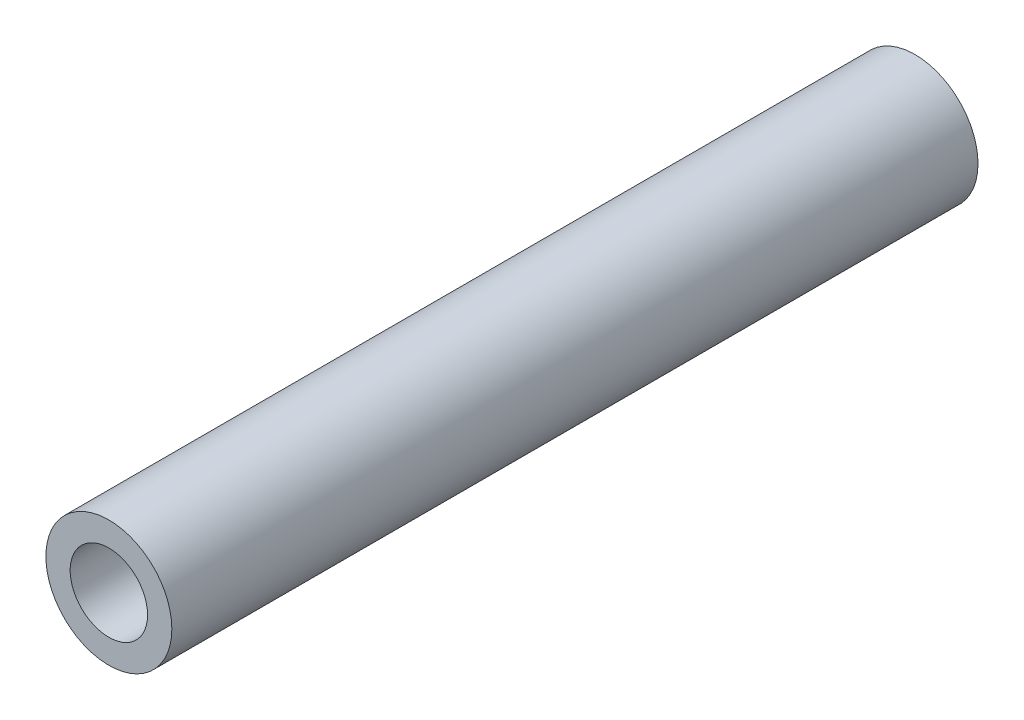
ISO-10303-21;
HEADER;
FILE_DESCRIPTION(('STEP AP214'),'2;1');
FILE_NAME('part.step','',(''),(''),'','','');
FILE_SCHEMA(('AUTOMOTIVE_DESIGN { 1 0 10303 214 1 1 1 1 }'));
ENDSEC;
DATA;
#1=APPLICATION_CONTEXT('core data for automotive mechanical design processes');
#2=APPLICATION_PROTOCOL_DEFINITION('international standard','automotive_design',2000,#1);
#3=PRODUCT_CONTEXT('',#1,'mechanical');
#4=PRODUCT('Part','Part','',(#3));
#5=PRODUCT_RELATED_PRODUCT_CATEGORY('part','',(#4));
#6=PRODUCT_DEFINITION_FORMATION('','',#4);
#7=PRODUCT_DEFINITION_CONTEXT('part definition',#1,'design');
#8=PRODUCT_DEFINITION('design','',#6,#7);
#9=PRODUCT_DEFINITION_SHAPE('','',#8);
#10=(LENGTH_UNIT() NAMED_UNIT(*) SI_UNIT(.MILLI.,.METRE.));
#11=(NAMED_UNIT(*) PLANE_ANGLE_UNIT() SI_UNIT($,.RADIAN.));
#12=(NAMED_UNIT(*) SI_UNIT($,.STERADIAN.) SOLID_ANGLE_UNIT());
#13=UNCERTAINTY_MEASURE_WITH_UNIT(LENGTH_MEASURE(1.E-05),#10,'distance_accuracy_value','');
#14=(GEOMETRIC_REPRESENTATION_CONTEXT(3) GLOBAL_UNCERTAINTY_ASSIGNED_CONTEXT((#13)) GLOBAL_UNIT_ASSIGNED_CONTEXT((#10,
#11,#12)) REPRESENTATION_CONTEXT('',''));
#15=CARTESIAN_POINT('',(0.,0.,0.));
#16=DIRECTION('',(0.,0.,1.));
#17=DIRECTION('',(1.,0.,0.));
#18=AXIS2_PLACEMENT_3D('',#15,#16,#17);
#19=CARTESIAN_POINT('',(0.,0.,25.4));
#20=DIRECTION('',(0.,0.,1.));
#21=DIRECTION('',(1.,0.,0.));
#22=AXIS2_PLACEMENT_3D('',#19,#20,#21);
#23=PLANE('',#22);
#24=CARTESIAN_POINT('',(0.,0.,25.4));
#25=DIRECTION('',(0.,0.,1.));
#26=DIRECTION('',(1.,0.,0.));
#27=AXIS2_PLACEMENT_3D('',#24,#25,#26);
#28=CIRCLE('',#27,3.96875);
#29=CARTESIAN_POINT('',(3.96875,0.,25.4));
#30=VERTEX_POINT('',#29);
#31=EDGE_CURVE('E10',#30,#30,#28,.T.);
#32=ORIENTED_EDGE('',*,*,#31,.T.);
#33=EDGE_LOOP('',(#32));
#34=FACE_BOUND('',#33,.T.);
#35=CARTESIAN_POINT('',(0.,0.,25.4));
#36=DIRECTION('',(0.,0.,1.));
#37=DIRECTION('',(1.,0.,0.));
#38=AXIS2_PLACEMENT_3D('',#35,#36,#37);
#39=CIRCLE('',#38,2.4384);
#40=CARTESIAN_POINT('',(2.4384,0.,25.4));
#41=VERTEX_POINT('',#40);
#42=EDGE_CURVE('E41',#41,#41,#39,.T.);
#43=ORIENTED_EDGE('',*,*,#42,.F.);
#44=EDGE_LOOP('',(#43));
#45=FACE_BOUND('',#44,.T.);
#46=ADVANCED_FACE('F30',(#34,#45),#23,.T.);
#47=CARTESIAN_POINT('',(0.,0.,-25.4));
#48=DIRECTION('',(0.,0.,1.));
#49=DIRECTION('',(1.,0.,0.));
#50=AXIS2_PLACEMENT_3D('',#47,#48,#49);
#51=PLANE('',#50);
#52=CARTESIAN_POINT('',(0.,0.,-25.4));
#53=DIRECTION('',(0.,0.,1.));
#54=DIRECTION('',(1.,0.,0.));
#55=AXIS2_PLACEMENT_3D('',#52,#53,#54);
#56=CIRCLE('',#55,3.96875);
#57=CARTESIAN_POINT('',(3.96875,0.,-25.4));
#58=VERTEX_POINT('',#57);
#59=EDGE_CURVE('E34',#58,#58,#56,.T.);
#60=ORIENTED_EDGE('',*,*,#59,.F.);
#61=EDGE_LOOP('',(#60));
#62=FACE_BOUND('',#61,.T.);
#63=CARTESIAN_POINT('',(0.,0.,-25.4));
#64=DIRECTION('',(0.,0.,1.));
#65=DIRECTION('',(1.,0.,0.));
#66=AXIS2_PLACEMENT_3D('',#63,#64,#65);
#67=CIRCLE('',#66,2.4384);
#68=CARTESIAN_POINT('',(2.4384,0.,-25.4));
#69=VERTEX_POINT('',#68);
#70=EDGE_CURVE('E43',#69,#69,#67,.T.);
#71=ORIENTED_EDGE('',*,*,#70,.T.);
#72=EDGE_LOOP('',(#71));
#73=FACE_BOUND('',#72,.T.);
#74=ADVANCED_FACE('F53',(#62,#73),#51,.F.);
#75=CARTESIAN_POINT('',(0.,0.,25.4));
#76=DIRECTION('',(0.,0.,-1.));
#77=DIRECTION('',(-1.,0.,0.));
#78=AXIS2_PLACEMENT_3D('',#75,#76,#77);
#79=CYLINDRICAL_SURFACE('',#78,3.96875);
#80=ORIENTED_EDGE('',*,*,#31,.F.);
#81=EDGE_LOOP('',(#80));
#82=FACE_BOUND('',#81,.T.);
#83=ORIENTED_EDGE('',*,*,#59,.T.);
#84=EDGE_LOOP('',(#83));
#85=FACE_BOUND('',#84,.T.);
#86=ADVANCED_FACE('F32',(#82,#85),#79,.T.);
#87=CARTESIAN_POINT('',(0.,0.,25.4));
#88=DIRECTION('',(0.,0.,-1.));
#89=DIRECTION('',(-1.,0.,0.));
#90=AXIS2_PLACEMENT_3D('',#87,#88,#89);
#91=CYLINDRICAL_SURFACE('',#90,2.4384);
#92=ORIENTED_EDGE('',*,*,#42,.T.);
#93=EDGE_LOOP('',(#92));
#94=FACE_BOUND('',#93,.T.);
#95=ORIENTED_EDGE('',*,*,#70,.F.);
#96=EDGE_LOOP('',(#95));
#97=FACE_BOUND('',#96,.T.);
#98=ADVANCED_FACE('F49',(#94,#97),#91,.F.);
#99=CLOSED_SHELL('',(#46,#74,#86,#98));
#100=MANIFOLD_SOLID_BREP('B2',#99);
#101=ADVANCED_BREP_SHAPE_REPRESENTATION('',(#18,#100),#14);
#102=SHAPE_DEFINITION_REPRESENTATION(#9,#101);
ENDSEC;
END-ISO-10303-21;
